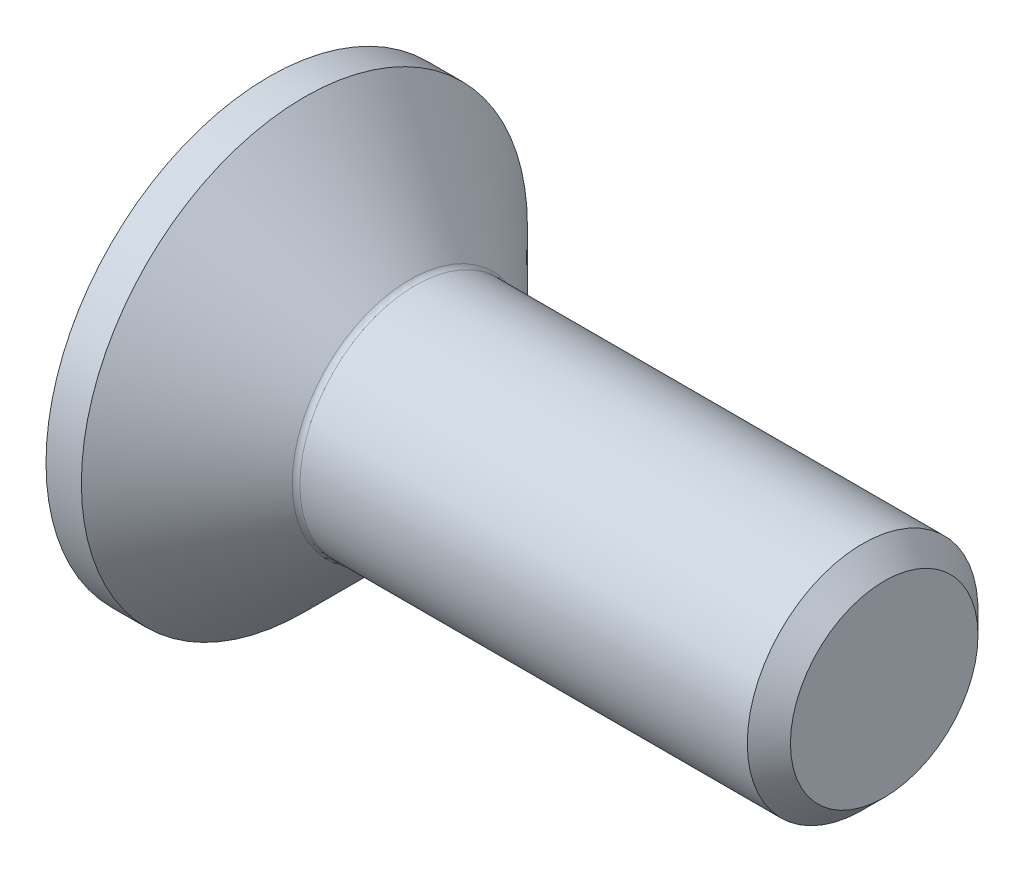
ISO-10303-21;
HEADER;
FILE_DESCRIPTION(('STEP AP214'),'2;1');
FILE_NAME('part.step','',(''),(''),'','','');
FILE_SCHEMA(('AUTOMOTIVE_DESIGN { 1 0 10303 214 1 1 1 1 }'));
ENDSEC;
DATA;
#1=APPLICATION_CONTEXT('core data for automotive mechanical design processes');
#2=APPLICATION_PROTOCOL_DEFINITION('international standard','automotive_design',2000,#1);
#3=PRODUCT_CONTEXT('',#1,'mechanical');
#4=PRODUCT('Part','Part','',(#3));
#5=PRODUCT_RELATED_PRODUCT_CATEGORY('part','',(#4));
#6=PRODUCT_DEFINITION_FORMATION('','',#4);
#7=PRODUCT_DEFINITION_CONTEXT('part definition',#1,'design');
#8=PRODUCT_DEFINITION('design','',#6,#7);
#9=PRODUCT_DEFINITION_SHAPE('','',#8);
#10=(LENGTH_UNIT() NAMED_UNIT(*) SI_UNIT(.MILLI.,.METRE.));
#11=(NAMED_UNIT(*) PLANE_ANGLE_UNIT() SI_UNIT($,.RADIAN.));
#12=(NAMED_UNIT(*) SI_UNIT($,.STERADIAN.) SOLID_ANGLE_UNIT());
#13=UNCERTAINTY_MEASURE_WITH_UNIT(LENGTH_MEASURE(1.E-05),#10,'distance_accuracy_value','');
#14=(GEOMETRIC_REPRESENTATION_CONTEXT(3) GLOBAL_UNCERTAINTY_ASSIGNED_CONTEXT((#13)) GLOBAL_UNIT_ASSIGNED_CONTEXT((#10,
#11,#12)) REPRESENTATION_CONTEXT('',''));
#15=CARTESIAN_POINT('',(0.,0.,0.));
#16=DIRECTION('',(0.,0.,1.));
#17=DIRECTION('',(1.,0.,0.));
#18=AXIS2_PLACEMENT_3D('',#15,#16,#17);
#19=CARTESIAN_POINT('',(0.,0.,0.));
#20=DIRECTION('',(-1.,0.,0.));
#21=DIRECTION('',(0.,0.,1.));
#22=AXIS2_PLACEMENT_3D('',#19,#20,#21);
#23=PLANE('',#22);
#24=CARTESIAN_POINT('',(0.,0.,0.));
#25=DIRECTION('',(-1.,0.,0.));
#26=DIRECTION('',(0.,0.,1.));
#27=AXIS2_PLACEMENT_3D('',#24,#25,#26);
#28=CIRCLE('',#27,2.9);
#29=CARTESIAN_POINT('',(0.,0.,2.9));
#30=VERTEX_POINT('',#29);
#31=EDGE_CURVE('E154',#30,#30,#28,.T.);
#32=ORIENTED_EDGE('',*,*,#31,.T.);
#33=EDGE_LOOP('',(#32));
#34=FACE_BOUND('',#33,.T.);
#35=DIRECTION('',(0.,-0.499999999999998,-0.86602540378444));
#36=VECTOR('',#35,1.);
#37=CARTESIAN_POINT('',(0.,-0.577350269189626,1.));
#38=LINE('',#37,#36);
#39=CARTESIAN_POINT('',(0.,-0.577350269189626,1.));
#40=VERTEX_POINT('',#39);
#41=CARTESIAN_POINT('',(0.,-1.15470053837925,0.));
#42=VERTEX_POINT('',#41);
#43=EDGE_CURVE('E120',#40,#42,#38,.T.);
#44=ORIENTED_EDGE('',*,*,#43,.T.);
#45=DIRECTION('',(0.,0.499999999999999,-0.866025403784439));
#46=VECTOR('',#45,1.);
#47=CARTESIAN_POINT('',(0.,-1.15470053837925,0.));
#48=LINE('',#47,#46);
#49=CARTESIAN_POINT('',(0.,-0.577350269189625,-1.));
#50=VERTEX_POINT('',#49);
#51=EDGE_CURVE('E51',#42,#50,#48,.T.);
#52=ORIENTED_EDGE('',*,*,#51,.T.);
#53=DIRECTION('',(0.,1.,0.));
#54=VECTOR('',#53,1.);
#55=CARTESIAN_POINT('',(0.,-0.577350269189625,-1.));
#56=LINE('',#55,#54);
#57=CARTESIAN_POINT('',(0.,0.577350269189626,-1.));
#58=VERTEX_POINT('',#57);
#59=EDGE_CURVE('E131',#50,#58,#56,.T.);
#60=ORIENTED_EDGE('',*,*,#59,.T.);
#61=DIRECTION('',(0.,0.5,0.866025403784439));
#62=VECTOR('',#61,1.);
#63=CARTESIAN_POINT('',(0.,0.577350269189626,-1.));
#64=LINE('',#63,#62);
#65=CARTESIAN_POINT('',(0.,1.15470053837925,0.));
#66=VERTEX_POINT('',#65);
#67=EDGE_CURVE('E255',#58,#66,#64,.T.);
#68=ORIENTED_EDGE('',*,*,#67,.T.);
#69=DIRECTION('',(0.,-0.499999999999999,0.866025403784439));
#70=VECTOR('',#69,1.);
#71=CARTESIAN_POINT('',(0.,1.15470053837925,0.));
#72=LINE('',#71,#70);
#73=CARTESIAN_POINT('',(0.,0.577350269189625,0.999999999999999));
#74=VERTEX_POINT('',#73);
#75=EDGE_CURVE('E258',#66,#74,#72,.T.);
#76=ORIENTED_EDGE('',*,*,#75,.T.);
#77=DIRECTION('',(0.,-1.,0.));
#78=VECTOR('',#77,1.);
#79=CARTESIAN_POINT('',(0.,0.577350269189625,0.999999999999999));
#80=LINE('',#79,#78);
#81=EDGE_CURVE('E261',#74,#40,#80,.T.);
#82=ORIENTED_EDGE('',*,*,#81,.T.);
#83=EDGE_LOOP('',(#44,#52,#60,#68,#76,#82));
#84=FACE_BOUND('',#83,.T.);
#85=ADVANCED_FACE('F36',(#34,#84),#23,.T.);
#86=CARTESIAN_POINT('',(0.,0.,0.));
#87=DIRECTION('',(-1.,0.,0.));
#88=DIRECTION('',(0.,0.,1.));
#89=AXIS2_PLACEMENT_3D('',#86,#87,#88);
#90=CYLINDRICAL_SURFACE('',#89,2.9);
#91=CARTESIAN_POINT('',(0.460000000000009,0.,0.));
#92=DIRECTION('',(-1.,0.,0.));
#93=DIRECTION('',(0.,0.,1.));
#94=AXIS2_PLACEMENT_3D('',#91,#92,#93);
#95=CIRCLE('',#94,2.9);
#96=CARTESIAN_POINT('',(0.460000000000009,0.,2.9));
#97=VERTEX_POINT('',#96);
#98=EDGE_CURVE('E151',#97,#97,#95,.T.);
#99=ORIENTED_EDGE('',*,*,#98,.T.);
#100=EDGE_LOOP('',(#99));
#101=FACE_BOUND('',#100,.T.);
#102=ORIENTED_EDGE('',*,*,#31,.F.);
#103=EDGE_LOOP('',(#102));
#104=FACE_BOUND('',#103,.T.);
#105=ADVANCED_FACE('F175',(#101,#104),#90,.T.);
#106=CARTESIAN_POINT('',(0.460000000000009,0.,0.));
#107=DIRECTION('',(-1.,0.,0.));
#108=DIRECTION('',(0.,0.,1.));
#109=AXIS2_PLACEMENT_3D('',#106,#107,#108);
#110=CONICAL_SURFACE('',#109,2.9,0.785398163397449);
#111=CARTESIAN_POINT('',(1.8307106781187,0.,0.));
#112=DIRECTION('',(-1.,0.,0.));
#113=DIRECTION('',(0.,0.,1.));
#114=AXIS2_PLACEMENT_3D('',#111,#112,#113);
#115=CIRCLE('',#114,1.52928932188131);
#116=CARTESIAN_POINT('',(1.8307106781187,0.,1.52928932188131));
#117=VERTEX_POINT('',#116);
#118=EDGE_CURVE('E44',#117,#117,#115,.T.);
#119=ORIENTED_EDGE('',*,*,#118,.T.);
#120=EDGE_LOOP('',(#119));
#121=FACE_BOUND('',#120,.T.);
#122=ORIENTED_EDGE('',*,*,#98,.F.);
#123=EDGE_LOOP('',(#122));
#124=FACE_BOUND('',#123,.T.);
#125=ADVANCED_FACE('F159',(#121,#124),#110,.T.);
#126=CARTESIAN_POINT('',(0.,0.,0.));
#127=DIRECTION('',(-1.,0.,0.));
#128=DIRECTION('',(0.,0.,1.));
#129=AXIS2_PLACEMENT_3D('',#126,#127,#128);
#130=CYLINDRICAL_SURFACE('',#129,1.49999999999996);
#131=CARTESIAN_POINT('',(1.90142135623735,0.,0.));
#132=DIRECTION('',(-1.,0.,0.));
#133=DIRECTION('',(0.,0.,1.));
#134=AXIS2_PLACEMENT_3D('',#131,#132,#133);
#135=CIRCLE('',#134,1.49999999999996);
#136=CARTESIAN_POINT('',(1.90142135623735,0.,1.49999999999996));
#137=VERTEX_POINT('',#136);
#138=EDGE_CURVE('E11',#137,#137,#135,.F.);
#139=ORIENTED_EDGE('',*,*,#138,.T.);
#140=EDGE_LOOP('',(#139));
#141=FACE_BOUND('',#140,.T.);
#142=CARTESIAN_POINT('',(7.71949999999994,0.,0.));
#143=DIRECTION('',(-1.,0.,0.));
#144=DIRECTION('',(0.,0.,1.));
#145=AXIS2_PLACEMENT_3D('',#142,#143,#144);
#146=CIRCLE('',#145,1.49999999999993);
#147=CARTESIAN_POINT('',(7.71949999999994,0.,1.49999999999993));
#148=VERTEX_POINT('',#147);
#149=EDGE_CURVE('E148',#148,#148,#146,.T.);
#150=ORIENTED_EDGE('',*,*,#149,.T.);
#151=EDGE_LOOP('',(#150));
#152=FACE_BOUND('',#151,.T.);
#153=ADVANCED_FACE('F186',(#141,#152),#130,.T.);
#154=CARTESIAN_POINT('',(8.,0.,0.));
#155=DIRECTION('',(-1.,0.,0.));
#156=DIRECTION('',(0.,0.,1.));
#157=AXIS2_PLACEMENT_3D('',#154,#155,#156);
#158=CONICAL_SURFACE('',#157,1.2195,0.785398163397206);
#159=ORIENTED_EDGE('',*,*,#149,.F.);
#160=EDGE_LOOP('',(#159));
#161=FACE_BOUND('',#160,.T.);
#162=CARTESIAN_POINT('',(8.,0.,0.));
#163=DIRECTION('',(-1.,0.,0.));
#164=DIRECTION('',(0.,0.,1.));
#165=AXIS2_PLACEMENT_3D('',#162,#163,#164);
#166=CIRCLE('',#165,1.2195);
#167=CARTESIAN_POINT('',(8.,0.,1.2195));
#168=VERTEX_POINT('',#167);
#169=EDGE_CURVE('E144',#168,#168,#166,.T.);
#170=ORIENTED_EDGE('',*,*,#169,.T.);
#171=EDGE_LOOP('',(#170));
#172=FACE_BOUND('',#171,.T.);
#173=ADVANCED_FACE('F170',(#161,#172),#158,.T.);
#174=CARTESIAN_POINT('',(8.,1.2195,0.));
#175=DIRECTION('',(1.,0.,0.));
#176=DIRECTION('',(0.,0.,-1.));
#177=AXIS2_PLACEMENT_3D('',#174,#175,#176);
#178=PLANE('',#177);
#179=ORIENTED_EDGE('',*,*,#169,.F.);
#180=EDGE_LOOP('',(#179));
#181=FACE_BOUND('',#180,.T.);
#182=ADVANCED_FACE('F163',(#181),#178,.T.);
#183=CARTESIAN_POINT('',(1.90142135623735,0.,0.));
#184=DIRECTION('',(-1.,0.,0.));
#185=DIRECTION('',(0.,0.,1.));
#186=AXIS2_PLACEMENT_3D('',#183,#184,#185);
#187=TOROIDAL_SURFACE('',#186,1.59999999999997,0.1);
#188=ORIENTED_EDGE('',*,*,#138,.F.);
#189=EDGE_LOOP('',(#188));
#190=FACE_BOUND('',#189,.T.);
#191=ORIENTED_EDGE('',*,*,#118,.F.);
#192=EDGE_LOOP('',(#191));
#193=FACE_BOUND('',#192,.T.);
#194=ADVANCED_FACE('F38',(#190,#193),#187,.F.);
#195=CARTESIAN_POINT('',(1.1,-1.15470053837925,0.));
#196=DIRECTION('',(0.,0.866025403784439,0.499999999999999));
#197=DIRECTION('',(0.,-0.499999999999999,0.866025403784439));
#198=AXIS2_PLACEMENT_3D('',#195,#196,#197);
#199=PLANE('',#198);
#200=ORIENTED_EDGE('',*,*,#51,.F.);
#201=DIRECTION('',(-1.,0.,0.));
#202=VECTOR('',#201,1.);
#203=CARTESIAN_POINT('',(1.1,-1.15470053837925,0.));
#204=LINE('',#203,#202);
#205=CARTESIAN_POINT('',(1.1,-1.15470053837925,0.));
#206=VERTEX_POINT('',#205);
#207=EDGE_CURVE('E252',#206,#42,#204,.T.);
#208=ORIENTED_EDGE('',*,*,#207,.F.);
#209=DIRECTION('',(0.,0.499999999999999,-0.866025403784439));
#210=VECTOR('',#209,1.);
#211=CARTESIAN_POINT('',(1.1,-1.15470053837925,0.));
#212=LINE('',#211,#210);
#213=CARTESIAN_POINT('',(1.1,-0.866025403784438,-0.499999999999998));
#214=VERTEX_POINT('',#213);
#215=EDGE_CURVE('E116',#206,#214,#212,.T.);
#216=ORIENTED_EDGE('',*,*,#215,.T.);
#217=CARTESIAN_POINT('',(1.1,-0.577350269189625,-1.));
#218=VERTEX_POINT('',#217);
#219=EDGE_CURVE('E112',#214,#218,#212,.T.);
#220=ORIENTED_EDGE('',*,*,#219,.T.);
#221=DIRECTION('',(-1.,0.,0.));
#222=VECTOR('',#221,1.);
#223=CARTESIAN_POINT('',(1.1,-0.577350269189625,-1.));
#224=LINE('',#223,#222);
#225=EDGE_CURVE('E114',#218,#50,#224,.T.);
#226=ORIENTED_EDGE('',*,*,#225,.T.);
#227=EDGE_LOOP('',(#200,#208,#216,#220,#226));
#228=FACE_BOUND('',#227,.T.);
#229=ADVANCED_FACE('F113',(#228),#199,.T.);
#230=CARTESIAN_POINT('',(1.1,-0.577350269189625,-1.));
#231=DIRECTION('',(0.,0.,1.));
#232=DIRECTION('',(1.,0.,0.));
#233=AXIS2_PLACEMENT_3D('',#230,#231,#232);
#234=PLANE('',#233);
#235=ORIENTED_EDGE('',*,*,#59,.F.);
#236=ORIENTED_EDGE('',*,*,#225,.F.);
#237=DIRECTION('',(0.,1.,0.));
#238=VECTOR('',#237,1.);
#239=CARTESIAN_POINT('',(1.1,-0.577350269189625,-1.));
#240=LINE('',#239,#238);
#241=CARTESIAN_POINT('',(1.1,0.,-1.));
#242=VERTEX_POINT('',#241);
#243=EDGE_CURVE('E59',#218,#242,#240,.T.);
#244=ORIENTED_EDGE('',*,*,#243,.T.);
#245=CARTESIAN_POINT('',(1.1,0.577350269189626,-1.));
#246=VERTEX_POINT('',#245);
#247=EDGE_CURVE('E126',#242,#246,#240,.T.);
#248=ORIENTED_EDGE('',*,*,#247,.T.);
#249=DIRECTION('',(-1.,0.,0.));
#250=VECTOR('',#249,1.);
#251=CARTESIAN_POINT('',(1.1,0.577350269189626,-1.));
#252=LINE('',#251,#250);
#253=EDGE_CURVE('E133',#246,#58,#252,.T.);
#254=ORIENTED_EDGE('',*,*,#253,.T.);
#255=EDGE_LOOP('',(#235,#236,#244,#248,#254));
#256=FACE_BOUND('',#255,.T.);
#257=ADVANCED_FACE('F128',(#256),#234,.T.);
#258=CARTESIAN_POINT('',(1.1,0.577350269189626,-1.));
#259=DIRECTION('',(0.,-0.866025403784438,0.5));
#260=DIRECTION('',(0.,-0.5,-0.866025403784439));
#261=AXIS2_PLACEMENT_3D('',#258,#259,#260);
#262=PLANE('',#261);
#263=ORIENTED_EDGE('',*,*,#67,.F.);
#264=ORIENTED_EDGE('',*,*,#253,.F.);
#265=DIRECTION('',(0.,0.5,0.866025403784439));
#266=VECTOR('',#265,1.);
#267=CARTESIAN_POINT('',(1.1,0.577350269189626,-1.));
#268=LINE('',#267,#266);
#269=CARTESIAN_POINT('',(1.1,0.866025403784439,-0.5));
#270=VERTEX_POINT('',#269);
#271=EDGE_CURVE('E233',#246,#270,#268,.T.);
#272=ORIENTED_EDGE('',*,*,#271,.T.);
#273=CARTESIAN_POINT('',(1.1,1.15470053837925,0.));
#274=VERTEX_POINT('',#273);
#275=EDGE_CURVE('E125',#270,#274,#268,.T.);
#276=ORIENTED_EDGE('',*,*,#275,.T.);
#277=DIRECTION('',(-1.,0.,0.));
#278=VECTOR('',#277,1.);
#279=CARTESIAN_POINT('',(1.1,1.15470053837925,0.));
#280=LINE('',#279,#278);
#281=EDGE_CURVE('E139',#274,#66,#280,.T.);
#282=ORIENTED_EDGE('',*,*,#281,.T.);
#283=EDGE_LOOP('',(#263,#264,#272,#276,#282));
#284=FACE_BOUND('',#283,.T.);
#285=ADVANCED_FACE('F200',(#284),#262,.T.);
#286=CARTESIAN_POINT('',(1.1,1.15470053837925,0.));
#287=DIRECTION('',(0.,-0.866025403784439,-0.499999999999999));
#288=DIRECTION('',(0.,0.499999999999999,-0.866025403784439));
#289=AXIS2_PLACEMENT_3D('',#286,#287,#288);
#290=PLANE('',#289);
#291=ORIENTED_EDGE('',*,*,#75,.F.);
#292=ORIENTED_EDGE('',*,*,#281,.F.);
#293=DIRECTION('',(0.,-0.499999999999999,0.866025403784439));
#294=VECTOR('',#293,1.);
#295=CARTESIAN_POINT('',(1.1,1.15470053837925,0.));
#296=LINE('',#295,#294);
#297=CARTESIAN_POINT('',(1.1,0.866025403784438,0.499999999999999));
#298=VERTEX_POINT('',#297);
#299=EDGE_CURVE('E240',#274,#298,#296,.T.);
#300=ORIENTED_EDGE('',*,*,#299,.T.);
#301=CARTESIAN_POINT('',(1.1,0.577350269189625,0.999999999999999));
#302=VERTEX_POINT('',#301);
#303=EDGE_CURVE('E238',#298,#302,#296,.T.);
#304=ORIENTED_EDGE('',*,*,#303,.T.);
#305=DIRECTION('',(-1.,0.,0.));
#306=VECTOR('',#305,1.);
#307=CARTESIAN_POINT('',(1.1,0.577350269189625,0.999999999999999));
#308=LINE('',#307,#306);
#309=EDGE_CURVE('E270',#302,#74,#308,.T.);
#310=ORIENTED_EDGE('',*,*,#309,.T.);
#311=EDGE_LOOP('',(#291,#292,#300,#304,#310));
#312=FACE_BOUND('',#311,.T.);
#313=ADVANCED_FACE('F203',(#312),#290,.T.);
#314=CARTESIAN_POINT('',(1.1,0.577350269189625,0.999999999999999));
#315=DIRECTION('',(0.,0.,-1.));
#316=DIRECTION('',(0.,1.,0.));
#317=AXIS2_PLACEMENT_3D('',#314,#315,#316);
#318=PLANE('',#317);
#319=ORIENTED_EDGE('',*,*,#81,.F.);
#320=ORIENTED_EDGE('',*,*,#309,.F.);
#321=DIRECTION('',(0.,-1.,0.));
#322=VECTOR('',#321,1.);
#323=CARTESIAN_POINT('',(1.1,0.577350269189625,0.999999999999999));
#324=LINE('',#323,#322);
#325=CARTESIAN_POINT('',(1.1,0.,1.));
#326=VERTEX_POINT('',#325);
#327=EDGE_CURVE('E245',#302,#326,#324,.T.);
#328=ORIENTED_EDGE('',*,*,#327,.T.);
#329=CARTESIAN_POINT('',(1.1,-0.577350269189626,1.));
#330=VERTEX_POINT('',#329);
#331=EDGE_CURVE('E244',#326,#330,#324,.T.);
#332=ORIENTED_EDGE('',*,*,#331,.T.);
#333=DIRECTION('',(-1.,0.,0.));
#334=VECTOR('',#333,1.);
#335=CARTESIAN_POINT('',(1.1,-0.577350269189626,1.));
#336=LINE('',#335,#334);
#337=EDGE_CURVE('E267',#330,#40,#336,.T.);
#338=ORIENTED_EDGE('',*,*,#337,.T.);
#339=EDGE_LOOP('',(#319,#320,#328,#332,#338));
#340=FACE_BOUND('',#339,.T.);
#341=ADVANCED_FACE('F207',(#340),#318,.T.);
#342=CARTESIAN_POINT('',(1.1,-0.577350269189626,1.));
#343=DIRECTION('',(0.,0.86602540378444,-0.499999999999998));
#344=DIRECTION('',(0.,0.499999999999998,0.86602540378444));
#345=AXIS2_PLACEMENT_3D('',#342,#343,#344);
#346=PLANE('',#345);
#347=ORIENTED_EDGE('',*,*,#43,.F.);
#348=ORIENTED_EDGE('',*,*,#337,.F.);
#349=DIRECTION('',(0.,-0.499999999999998,-0.86602540378444));
#350=VECTOR('',#349,1.);
#351=CARTESIAN_POINT('',(1.1,-0.577350269189626,1.));
#352=LINE('',#351,#350);
#353=CARTESIAN_POINT('',(1.1,-0.866025403784439,0.499999999999997));
#354=VERTEX_POINT('',#353);
#355=EDGE_CURVE('E249',#330,#354,#352,.T.);
#356=ORIENTED_EDGE('',*,*,#355,.T.);
#357=EDGE_CURVE('E248',#354,#206,#352,.T.);
#358=ORIENTED_EDGE('',*,*,#357,.T.);
#359=ORIENTED_EDGE('',*,*,#207,.T.);
#360=EDGE_LOOP('',(#347,#348,#356,#358,#359));
#361=FACE_BOUND('',#360,.T.);
#362=ADVANCED_FACE('F211',(#361),#346,.T.);
#363=CARTESIAN_POINT('',(1.1,-0.577350269189626,-1.));
#364=DIRECTION('',(1.,0.,0.));
#365=DIRECTION('',(0.,0.,-1.));
#366=AXIS2_PLACEMENT_3D('',#363,#364,#365);
#367=PLANE('',#366);
#368=ORIENTED_EDGE('',*,*,#243,.F.);
#369=ORIENTED_EDGE('',*,*,#219,.F.);
#370=CARTESIAN_POINT('',(1.1,0.,0.));
#371=DIRECTION('',(-1.,0.,0.));
#372=DIRECTION('',(0.,0.,1.));
#373=AXIS2_PLACEMENT_3D('',#370,#371,#372);
#374=CIRCLE('',#373,1.);
#375=EDGE_CURVE('E123',#242,#214,#374,.T.);
#376=ORIENTED_EDGE('',*,*,#375,.F.);
#377=EDGE_LOOP('',(#368,#369,#376));
#378=FACE_BOUND('',#377,.T.);
#379=ADVANCED_FACE('F122',(#378),#367,.F.);
#380=ORIENTED_EDGE('',*,*,#215,.F.);
#381=ORIENTED_EDGE('',*,*,#357,.F.);
#382=EDGE_CURVE('E136',#214,#354,#374,.T.);
#383=ORIENTED_EDGE('',*,*,#382,.F.);
#384=EDGE_LOOP('',(#380,#381,#383));
#385=FACE_BOUND('',#384,.T.);
#386=ADVANCED_FACE('F217',(#385),#367,.F.);
#387=ORIENTED_EDGE('',*,*,#355,.F.);
#388=ORIENTED_EDGE('',*,*,#331,.F.);
#389=EDGE_CURVE('E132',#354,#326,#374,.T.);
#390=ORIENTED_EDGE('',*,*,#389,.F.);
#391=EDGE_LOOP('',(#387,#388,#390));
#392=FACE_BOUND('',#391,.T.);
#393=ADVANCED_FACE('F221',(#392),#367,.F.);
#394=ORIENTED_EDGE('',*,*,#327,.F.);
#395=ORIENTED_EDGE('',*,*,#303,.F.);
#396=EDGE_CURVE('E138',#326,#298,#374,.T.);
#397=ORIENTED_EDGE('',*,*,#396,.F.);
#398=EDGE_LOOP('',(#394,#395,#397));
#399=FACE_BOUND('',#398,.T.);
#400=ADVANCED_FACE('F229',(#399),#367,.F.);
#401=ORIENTED_EDGE('',*,*,#299,.F.);
#402=ORIENTED_EDGE('',*,*,#275,.F.);
#403=EDGE_CURVE('E145',#298,#270,#374,.T.);
#404=ORIENTED_EDGE('',*,*,#403,.F.);
#405=EDGE_LOOP('',(#401,#402,#404));
#406=FACE_BOUND('',#405,.T.);
#407=ADVANCED_FACE('F224',(#406),#367,.F.);
#408=ORIENTED_EDGE('',*,*,#271,.F.);
#409=ORIENTED_EDGE('',*,*,#247,.F.);
#410=EDGE_CURVE('E234',#270,#242,#374,.T.);
#411=ORIENTED_EDGE('',*,*,#410,.F.);
#412=EDGE_LOOP('',(#408,#409,#411));
#413=FACE_BOUND('',#412,.T.);
#414=ADVANCED_FACE('F195',(#413),#367,.F.);
#415=CARTESIAN_POINT('',(1.1,0.,0.));
#416=DIRECTION('',(-1.,0.,0.));
#417=DIRECTION('',(0.,0.,1.));
#418=AXIS2_PLACEMENT_3D('',#415,#416,#417);
#419=CONICAL_SURFACE('',#418,1.,1.04719755119659);
#420=CARTESIAN_POINT('',(1.67735026918963,0.,0.));
#421=VERTEX_POINT('',#420);
#422=VERTEX_LOOP('',#421);
#423=FACE_BOUND('',#422,.T.);
#424=ORIENTED_EDGE('',*,*,#396,.T.);
#425=ORIENTED_EDGE('',*,*,#403,.T.);
#426=ORIENTED_EDGE('',*,*,#410,.T.);
#427=ORIENTED_EDGE('',*,*,#375,.T.);
#428=ORIENTED_EDGE('',*,*,#382,.T.);
#429=ORIENTED_EDGE('',*,*,#389,.T.);
#430=EDGE_LOOP('',(#424,#425,#426,#427,#428,#429));
#431=FACE_BOUND('',#430,.T.);
#432=ADVANCED_FACE('F193',(#423,#431),#419,.F.);
#433=CLOSED_SHELL('',(#85,#105,#125,#153,#173,#182,#194,#229,#257,#285,#313,#341,#362,#379,#386,
#393,#400,#407,#414,#432));
#434=MANIFOLD_SOLID_BREP('B2',#433);
#435=ADVANCED_BREP_SHAPE_REPRESENTATION('',(#18,#434),#14);
#436=SHAPE_DEFINITION_REPRESENTATION(#9,#435);
ENDSEC;
END-ISO-10303-21;
